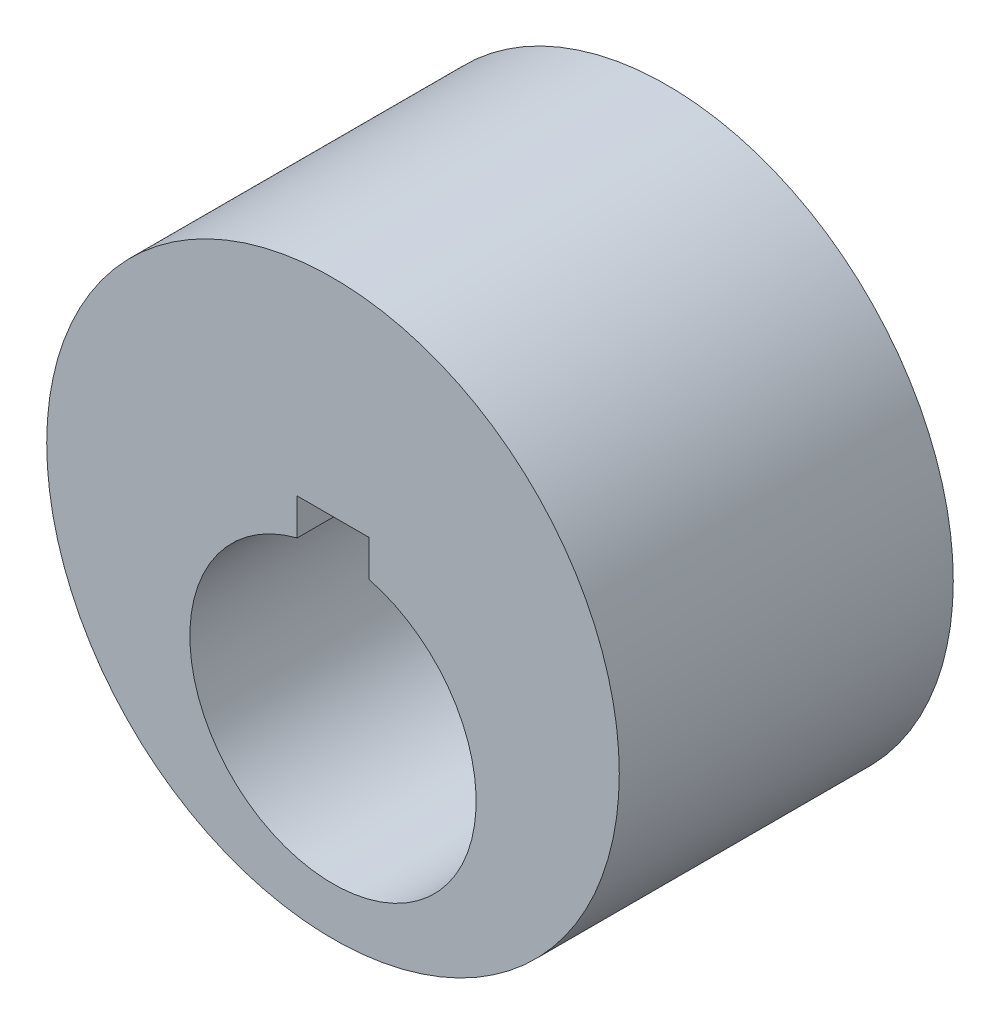
ISO-10303-21;
HEADER;
FILE_DESCRIPTION(('STEP AP214'),'2;1');
FILE_NAME('part.step','',(''),(''),'','','');
FILE_SCHEMA(('AUTOMOTIVE_DESIGN { 1 0 10303 214 1 1 1 1 }'));
ENDSEC;
DATA;
#1=APPLICATION_CONTEXT('core data for automotive mechanical design processes');
#2=APPLICATION_PROTOCOL_DEFINITION('international standard','automotive_design',2000,#1);
#3=PRODUCT_CONTEXT('',#1,'mechanical');
#4=PRODUCT('Part','Part','',(#3));
#5=PRODUCT_RELATED_PRODUCT_CATEGORY('part','',(#4));
#6=PRODUCT_DEFINITION_FORMATION('','',#4);
#7=PRODUCT_DEFINITION_CONTEXT('part definition',#1,'design');
#8=PRODUCT_DEFINITION('design','',#6,#7);
#9=PRODUCT_DEFINITION_SHAPE('','',#8);
#10=(LENGTH_UNIT() NAMED_UNIT(*) SI_UNIT(.MILLI.,.METRE.));
#11=(NAMED_UNIT(*) PLANE_ANGLE_UNIT() SI_UNIT($,.RADIAN.));
#12=(NAMED_UNIT(*) SI_UNIT($,.STERADIAN.) SOLID_ANGLE_UNIT());
#13=UNCERTAINTY_MEASURE_WITH_UNIT(LENGTH_MEASURE(1.E-05),#10,'distance_accuracy_value','');
#14=(GEOMETRIC_REPRESENTATION_CONTEXT(3) GLOBAL_UNCERTAINTY_ASSIGNED_CONTEXT((#13)) GLOBAL_UNIT_ASSIGNED_CONTEXT((#10,
#11,#12)) REPRESENTATION_CONTEXT('',''));
#15=CARTESIAN_POINT('',(0.,0.,0.));
#16=DIRECTION('',(0.,0.,1.));
#17=DIRECTION('',(1.,0.,0.));
#18=AXIS2_PLACEMENT_3D('',#15,#16,#17);
#19=CARTESIAN_POINT('',(0.,12.,42.));
#20=DIRECTION('',(0.,0.,-1.));
#21=DIRECTION('',(-1.,0.,0.));
#22=AXIS2_PLACEMENT_3D('',#19,#20,#21);
#23=CYLINDRICAL_SURFACE('',#22,36.);
#24=CARTESIAN_POINT('',(0.,12.,42.));
#25=DIRECTION('',(0.,0.,-1.));
#26=DIRECTION('',(-1.,0.,0.));
#27=AXIS2_PLACEMENT_3D('',#24,#25,#26);
#28=CIRCLE('',#27,36.);
#29=CARTESIAN_POINT('',(-36.,12.,42.));
#30=VERTEX_POINT('',#29);
#31=EDGE_CURVE('E11',#30,#30,#28,.T.);
#32=ORIENTED_EDGE('',*,*,#31,.T.);
#33=EDGE_LOOP('',(#32));
#34=FACE_BOUND('',#33,.T.);
#35=CARTESIAN_POINT('',(0.,12.,0.));
#36=DIRECTION('',(0.,0.,-1.));
#37=DIRECTION('',(-1.,0.,0.));
#38=AXIS2_PLACEMENT_3D('',#35,#36,#37);
#39=CIRCLE('',#38,36.);
#40=CARTESIAN_POINT('',(-36.,12.,0.));
#41=VERTEX_POINT('',#40);
#42=EDGE_CURVE('E45',#41,#41,#39,.T.);
#43=ORIENTED_EDGE('',*,*,#42,.F.);
#44=EDGE_LOOP('',(#43));
#45=FACE_BOUND('',#44,.T.);
#46=ADVANCED_FACE('F38',(#34,#45),#23,.T.);
#47=CARTESIAN_POINT('',(36.,12.,42.));
#48=DIRECTION('',(0.,0.,1.));
#49=DIRECTION('',(1.,0.,0.));
#50=AXIS2_PLACEMENT_3D('',#47,#48,#49);
#51=PLANE('',#50);
#52=CARTESIAN_POINT('',(0.,0.,42.));
#53=DIRECTION('',(0.,0.,1.));
#54=DIRECTION('',(1.,0.,0.));
#55=AXIS2_PLACEMENT_3D('',#52,#53,#54);
#56=CIRCLE('',#55,18.);
#57=CARTESIAN_POINT('',(-4.5,17.4284250579334,42.));
#58=VERTEX_POINT('',#57);
#59=CARTESIAN_POINT('',(4.50000000000404,17.4284250579323,42.));
#60=VERTEX_POINT('',#59);
#61=EDGE_CURVE('E93',#58,#60,#56,.T.);
#62=ORIENTED_EDGE('',*,*,#61,.F.);
#63=DIRECTION('',(0.,1.,0.));
#64=VECTOR('',#63,1.);
#65=CARTESIAN_POINT('',(-4.5,17.4284250579334,42.));
#66=LINE('',#65,#64);
#67=CARTESIAN_POINT('',(-4.5,22.,42.));
#68=VERTEX_POINT('',#67);
#69=EDGE_CURVE('E103',#58,#68,#66,.T.);
#70=ORIENTED_EDGE('',*,*,#69,.T.);
#71=DIRECTION('',(1.,0.,0.));
#72=VECTOR('',#71,1.);
#73=CARTESIAN_POINT('',(-4.5,22.,42.));
#74=LINE('',#73,#72);
#75=CARTESIAN_POINT('',(4.50000000000404,22.,42.));
#76=VERTEX_POINT('',#75);
#77=EDGE_CURVE('E115',#68,#76,#74,.T.);
#78=ORIENTED_EDGE('',*,*,#77,.T.);
#79=DIRECTION('',(0.,-1.,0.));
#80=VECTOR('',#79,1.);
#81=CARTESIAN_POINT('',(4.50000000000404,22.,42.));
#82=LINE('',#81,#80);
#83=EDGE_CURVE('E100',#76,#60,#82,.T.);
#84=ORIENTED_EDGE('',*,*,#83,.T.);
#85=EDGE_LOOP('',(#62,#70,#78,#84));
#86=FACE_BOUND('',#85,.T.);
#87=ORIENTED_EDGE('',*,*,#31,.F.);
#88=EDGE_LOOP('',(#87));
#89=FACE_BOUND('',#88,.T.);
#90=ADVANCED_FACE('F127',(#86,#89),#51,.T.);
#91=CARTESIAN_POINT('',(0.,12.,0.));
#92=DIRECTION('',(0.,0.,-1.));
#93=DIRECTION('',(-1.,0.,0.));
#94=AXIS2_PLACEMENT_3D('',#91,#92,#93);
#95=PLANE('',#94);
#96=CARTESIAN_POINT('',(0.,42.,0.));
#97=DIRECTION('',(0.,0.,-1.));
#98=DIRECTION('',(-1.,0.,0.));
#99=AXIS2_PLACEMENT_3D('',#96,#97,#98);
#100=CIRCLE('',#99,2.99999999999999);
#101=CARTESIAN_POINT('',(-2.99999999999999,42.,0.));
#102=VERTEX_POINT('',#101);
#103=EDGE_CURVE('E90',#102,#102,#100,.T.);
#104=ORIENTED_EDGE('',*,*,#103,.F.);
#105=EDGE_LOOP('',(#104));
#106=FACE_BOUND('',#105,.T.);
#107=CARTESIAN_POINT('',(0.,0.,0.));
#108=DIRECTION('',(0.,0.,1.));
#109=DIRECTION('',(1.,0.,0.));
#110=AXIS2_PLACEMENT_3D('',#107,#108,#109);
#111=CIRCLE('',#110,18.);
#112=CARTESIAN_POINT('',(-4.5,17.4284250579334,0.));
#113=VERTEX_POINT('',#112);
#114=CARTESIAN_POINT('',(4.50000000000404,17.4284250579323,0.));
#115=VERTEX_POINT('',#114);
#116=EDGE_CURVE('E97',#113,#115,#111,.T.);
#117=ORIENTED_EDGE('',*,*,#116,.T.);
#118=DIRECTION('',(0.,-1.,0.));
#119=VECTOR('',#118,1.);
#120=CARTESIAN_POINT('',(4.50000000000404,22.,0.));
#121=LINE('',#120,#119);
#122=CARTESIAN_POINT('',(4.50000000000404,22.,0.));
#123=VERTEX_POINT('',#122);
#124=EDGE_CURVE('E109',#123,#115,#121,.T.);
#125=ORIENTED_EDGE('',*,*,#124,.F.);
#126=DIRECTION('',(1.,0.,0.));
#127=VECTOR('',#126,1.);
#128=CARTESIAN_POINT('',(-4.5,22.,0.));
#129=LINE('',#128,#127);
#130=CARTESIAN_POINT('',(-4.5,22.,0.));
#131=VERTEX_POINT('',#130);
#132=EDGE_CURVE('E107',#131,#123,#129,.T.);
#133=ORIENTED_EDGE('',*,*,#132,.F.);
#134=DIRECTION('',(0.,1.,0.));
#135=VECTOR('',#134,1.);
#136=CARTESIAN_POINT('',(-4.5,17.4284250579334,0.));
#137=LINE('',#136,#135);
#138=EDGE_CURVE('E60',#113,#131,#137,.T.);
#139=ORIENTED_EDGE('',*,*,#138,.F.);
#140=EDGE_LOOP('',(#117,#125,#133,#139));
#141=FACE_BOUND('',#140,.T.);
#142=ORIENTED_EDGE('',*,*,#42,.T.);
#143=EDGE_LOOP('',(#142));
#144=FACE_BOUND('',#143,.T.);
#145=ADVANCED_FACE('F124',(#106,#141,#144),#95,.T.);
#146=CARTESIAN_POINT('',(-4.5,17.4284250579334,42.001));
#147=DIRECTION('',(-1.,0.,0.));
#148=DIRECTION('',(0.,0.,1.));
#149=AXIS2_PLACEMENT_3D('',#146,#147,#148);
#150=PLANE('',#149);
#151=DIRECTION('',(0.,0.,-1.));
#152=VECTOR('',#151,1.);
#153=CARTESIAN_POINT('',(-4.5,17.4284250579334,42.001));
#154=LINE('',#153,#152);
#155=EDGE_CURVE('E113',#58,#113,#154,.T.);
#156=ORIENTED_EDGE('',*,*,#155,.T.);
#157=ORIENTED_EDGE('',*,*,#138,.T.);
#158=DIRECTION('',(0.,0.,-1.));
#159=VECTOR('',#158,1.);
#160=CARTESIAN_POINT('',(-4.5,22.,42.001));
#161=LINE('',#160,#159);
#162=EDGE_CURVE('E112',#68,#131,#161,.T.);
#163=ORIENTED_EDGE('',*,*,#162,.F.);
#164=ORIENTED_EDGE('',*,*,#69,.F.);
#165=EDGE_LOOP('',(#156,#157,#163,#164));
#166=FACE_BOUND('',#165,.T.);
#167=ADVANCED_FACE('F138',(#166),#150,.F.);
#168=CARTESIAN_POINT('',(4.50000000000404,22.,42.001));
#169=DIRECTION('',(1.,0.,0.));
#170=DIRECTION('',(0.,1.,0.));
#171=AXIS2_PLACEMENT_3D('',#168,#169,#170);
#172=PLANE('',#171);
#173=DIRECTION('',(0.,0.,-1.));
#174=VECTOR('',#173,1.);
#175=CARTESIAN_POINT('',(4.50000000000404,22.,42.001));
#176=LINE('',#175,#174);
#177=EDGE_CURVE('E52',#76,#123,#176,.T.);
#178=ORIENTED_EDGE('',*,*,#177,.T.);
#179=ORIENTED_EDGE('',*,*,#124,.T.);
#180=DIRECTION('',(0.,0.,-1.));
#181=VECTOR('',#180,1.);
#182=CARTESIAN_POINT('',(4.50000000000404,17.4284250579323,42.001));
#183=LINE('',#182,#181);
#184=EDGE_CURVE('E116',#60,#115,#183,.T.);
#185=ORIENTED_EDGE('',*,*,#184,.F.);
#186=ORIENTED_EDGE('',*,*,#83,.F.);
#187=EDGE_LOOP('',(#178,#179,#185,#186));
#188=FACE_BOUND('',#187,.T.);
#189=ADVANCED_FACE('F145',(#188),#172,.F.);
#190=CARTESIAN_POINT('',(-4.5,22.,42.001));
#191=DIRECTION('',(0.,1.,0.));
#192=DIRECTION('',(0.,0.,1.));
#193=AXIS2_PLACEMENT_3D('',#190,#191,#192);
#194=PLANE('',#193);
#195=ORIENTED_EDGE('',*,*,#162,.T.);
#196=ORIENTED_EDGE('',*,*,#132,.T.);
#197=ORIENTED_EDGE('',*,*,#177,.F.);
#198=ORIENTED_EDGE('',*,*,#77,.F.);
#199=EDGE_LOOP('',(#195,#196,#197,#198));
#200=FACE_BOUND('',#199,.T.);
#201=ADVANCED_FACE('F146',(#200),#194,.F.);
#202=CARTESIAN_POINT('',(0.,0.,0.));
#203=DIRECTION('',(0.,0.,1.));
#204=DIRECTION('',(1.,0.,0.));
#205=AXIS2_PLACEMENT_3D('',#202,#203,#204);
#206=CYLINDRICAL_SURFACE('',#205,18.);
#207=ORIENTED_EDGE('',*,*,#61,.T.);
#208=ORIENTED_EDGE('',*,*,#184,.T.);
#209=ORIENTED_EDGE('',*,*,#116,.F.);
#210=ORIENTED_EDGE('',*,*,#155,.F.);
#211=EDGE_LOOP('',(#207,#208,#209,#210));
#212=FACE_BOUND('',#211,.T.);
#213=ADVANCED_FACE('F149',(#212),#206,.F.);
#214=CARTESIAN_POINT('',(0.,42.,0.));
#215=DIRECTION('',(0.,0.,-1.));
#216=DIRECTION('',(-1.,0.,0.));
#217=AXIS2_PLACEMENT_3D('',#214,#215,#216);
#218=CYLINDRICAL_SURFACE('',#217,2.99999999999999);
#219=CARTESIAN_POINT('',(0.,42.,14.));
#220=DIRECTION('',(0.,0.,-1.));
#221=DIRECTION('',(-1.,0.,0.));
#222=AXIS2_PLACEMENT_3D('',#219,#220,#221);
#223=CIRCLE('',#222,2.99999999999999);
#224=CARTESIAN_POINT('',(-2.99999999999999,42.,14.));
#225=VERTEX_POINT('',#224);
#226=EDGE_CURVE('E88',#225,#225,#223,.T.);
#227=ORIENTED_EDGE('',*,*,#226,.F.);
#228=EDGE_LOOP('',(#227));
#229=FACE_BOUND('',#228,.T.);
#230=ORIENTED_EDGE('',*,*,#103,.T.);
#231=EDGE_LOOP('',(#230));
#232=FACE_BOUND('',#231,.T.);
#233=ADVANCED_FACE('F84',(#229,#232),#218,.F.);
#234=CARTESIAN_POINT('',(0.,42.,14.));
#235=DIRECTION('',(0.,0.,-1.));
#236=DIRECTION('',(-1.,0.,0.));
#237=AXIS2_PLACEMENT_3D('',#234,#235,#236);
#238=CONICAL_SURFACE('',#237,2.99999999999999,1.04719755119984);
#239=CARTESIAN_POINT('',(0.,42.,15.7320508075559));
#240=VERTEX_POINT('',#239);
#241=VERTEX_LOOP('',#240);
#242=FACE_BOUND('',#241,.T.);
#243=ORIENTED_EDGE('',*,*,#226,.T.);
#244=EDGE_LOOP('',(#243));
#245=FACE_BOUND('',#244,.T.);
#246=ADVANCED_FACE('F81',(#242,#245),#238,.F.);
#247=CLOSED_SHELL('',(#46,#90,#145,#167,#189,#201,#213,#233,#246));
#248=MANIFOLD_SOLID_BREP('B2',#247);
#249=ADVANCED_BREP_SHAPE_REPRESENTATION('',(#18,#248),#14);
#250=SHAPE_DEFINITION_REPRESENTATION(#9,#249);
ENDSEC;
END-ISO-10303-21;
